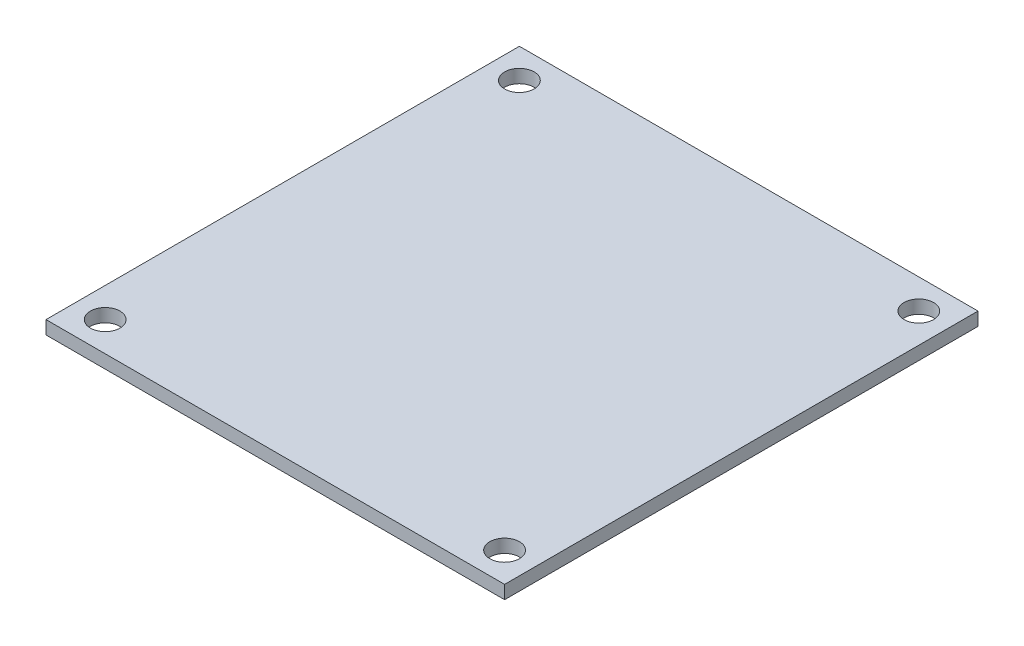
ISO-10303-21;
HEADER;
FILE_DESCRIPTION(('STEP AP214'),'2;1');
FILE_NAME('part.step','',(''),(''),'','','');
FILE_SCHEMA(('AUTOMOTIVE_DESIGN { 1 0 10303 214 1 1 1 1 }'));
ENDSEC;
DATA;
#1=APPLICATION_CONTEXT('core data for automotive mechanical design processes');
#2=APPLICATION_PROTOCOL_DEFINITION('international standard','automotive_design',2000,#1);
#3=PRODUCT_CONTEXT('',#1,'mechanical');
#4=PRODUCT('Part','Part','',(#3));
#5=PRODUCT_RELATED_PRODUCT_CATEGORY('part','',(#4));
#6=PRODUCT_DEFINITION_FORMATION('','',#4);
#7=PRODUCT_DEFINITION_CONTEXT('part definition',#1,'design');
#8=PRODUCT_DEFINITION('design','',#6,#7);
#9=PRODUCT_DEFINITION_SHAPE('','',#8);
#10=(LENGTH_UNIT() NAMED_UNIT(*) SI_UNIT(.MILLI.,.METRE.));
#11=(NAMED_UNIT(*) PLANE_ANGLE_UNIT() SI_UNIT($,.RADIAN.));
#12=(NAMED_UNIT(*) SI_UNIT($,.STERADIAN.) SOLID_ANGLE_UNIT());
#13=UNCERTAINTY_MEASURE_WITH_UNIT(LENGTH_MEASURE(1.E-05),#10,'distance_accuracy_value','');
#14=(GEOMETRIC_REPRESENTATION_CONTEXT(3) GLOBAL_UNCERTAINTY_ASSIGNED_CONTEXT((#13)) GLOBAL_UNIT_ASSIGNED_CONTEXT((#10,
#11,#12)) REPRESENTATION_CONTEXT('',''));
#15=CARTESIAN_POINT('',(0.,0.,0.));
#16=DIRECTION('',(0.,0.,1.));
#17=DIRECTION('',(1.,0.,0.));
#18=AXIS2_PLACEMENT_3D('',#15,#16,#17);
#19=CARTESIAN_POINT('',(0.,0.9,0.));
#20=DIRECTION('',(1.,0.,0.));
#21=DIRECTION('',(0.,0.,-1.));
#22=AXIS2_PLACEMENT_3D('',#19,#20,#21);
#23=PLANE('',#22);
#24=DIRECTION('',(0.,0.,1.));
#25=VECTOR('',#24,1.);
#26=CARTESIAN_POINT('',(0.,0.,0.));
#27=LINE('',#26,#25);
#28=CARTESIAN_POINT('',(0.,0.,-32.));
#29=VERTEX_POINT('',#28);
#30=CARTESIAN_POINT('',(0.,0.,0.));
#31=VERTEX_POINT('',#30);
#32=EDGE_CURVE('E110',#29,#31,#27,.T.);
#33=ORIENTED_EDGE('',*,*,#32,.T.);
#34=DIRECTION('',(0.,-1.,0.));
#35=VECTOR('',#34,1.);
#36=CARTESIAN_POINT('',(0.,0.9,0.));
#37=LINE('',#36,#35);
#38=CARTESIAN_POINT('',(0.,0.9,0.));
#39=VERTEX_POINT('',#38);
#40=EDGE_CURVE('E11',#39,#31,#37,.T.);
#41=ORIENTED_EDGE('',*,*,#40,.F.);
#42=DIRECTION('',(0.,0.,1.));
#43=VECTOR('',#42,1.);
#44=CARTESIAN_POINT('',(0.,0.9,0.));
#45=LINE('',#44,#43);
#46=CARTESIAN_POINT('',(0.,0.9,-32.));
#47=VERTEX_POINT('',#46);
#48=EDGE_CURVE('E98',#47,#39,#45,.T.);
#49=ORIENTED_EDGE('',*,*,#48,.F.);
#50=DIRECTION('',(0.,-1.,0.));
#51=VECTOR('',#50,1.);
#52=CARTESIAN_POINT('',(0.,0.9,-32.));
#53=LINE('',#52,#51);
#54=EDGE_CURVE('E106',#47,#29,#53,.T.);
#55=ORIENTED_EDGE('',*,*,#54,.T.);
#56=EDGE_LOOP('',(#33,#41,#49,#55));
#57=FACE_BOUND('',#56,.T.);
#58=ADVANCED_FACE('F47',(#57),#23,.F.);
#59=CARTESIAN_POINT('',(0.,0.9,0.));
#60=DIRECTION('',(0.,0.,-1.));
#61=DIRECTION('',(-1.,0.,0.));
#62=AXIS2_PLACEMENT_3D('',#59,#60,#61);
#63=PLANE('',#62);
#64=DIRECTION('',(1.,0.,0.));
#65=VECTOR('',#64,1.);
#66=CARTESIAN_POINT('',(0.,0.,0.));
#67=LINE('',#66,#65);
#68=CARTESIAN_POINT('',(31.,0.,0.));
#69=VERTEX_POINT('',#68);
#70=EDGE_CURVE('E102',#31,#69,#67,.T.);
#71=ORIENTED_EDGE('',*,*,#70,.T.);
#72=DIRECTION('',(0.,-1.,0.));
#73=VECTOR('',#72,1.);
#74=CARTESIAN_POINT('',(31.,0.9,0.));
#75=LINE('',#74,#73);
#76=CARTESIAN_POINT('',(31.,0.9,0.));
#77=VERTEX_POINT('',#76);
#78=EDGE_CURVE('E55',#77,#69,#75,.T.);
#79=ORIENTED_EDGE('',*,*,#78,.F.);
#80=DIRECTION('',(1.,0.,0.));
#81=VECTOR('',#80,1.);
#82=CARTESIAN_POINT('',(0.,0.9,0.));
#83=LINE('',#82,#81);
#84=EDGE_CURVE('E93',#39,#77,#83,.T.);
#85=ORIENTED_EDGE('',*,*,#84,.F.);
#86=ORIENTED_EDGE('',*,*,#40,.T.);
#87=EDGE_LOOP('',(#71,#79,#85,#86));
#88=FACE_BOUND('',#87,.T.);
#89=ADVANCED_FACE('F101',(#88),#63,.F.);
#90=CARTESIAN_POINT('',(31.,0.9,0.));
#91=DIRECTION('',(-1.,0.,0.));
#92=DIRECTION('',(0.,0.,1.));
#93=AXIS2_PLACEMENT_3D('',#90,#91,#92);
#94=PLANE('',#93);
#95=DIRECTION('',(0.,0.,-1.));
#96=VECTOR('',#95,1.);
#97=CARTESIAN_POINT('',(31.,0.,0.));
#98=LINE('',#97,#96);
#99=CARTESIAN_POINT('',(31.,0.,-32.));
#100=VERTEX_POINT('',#99);
#101=EDGE_CURVE('E80',#69,#100,#98,.T.);
#102=ORIENTED_EDGE('',*,*,#101,.T.);
#103=DIRECTION('',(0.,-1.,0.));
#104=VECTOR('',#103,1.);
#105=CARTESIAN_POINT('',(31.,0.9,-32.));
#106=LINE('',#105,#104);
#107=CARTESIAN_POINT('',(31.,0.9,-32.));
#108=VERTEX_POINT('',#107);
#109=EDGE_CURVE('E103',#108,#100,#106,.T.);
#110=ORIENTED_EDGE('',*,*,#109,.F.);
#111=DIRECTION('',(0.,0.,-1.));
#112=VECTOR('',#111,1.);
#113=CARTESIAN_POINT('',(31.,0.9,0.));
#114=LINE('',#113,#112);
#115=EDGE_CURVE('E96',#77,#108,#114,.T.);
#116=ORIENTED_EDGE('',*,*,#115,.F.);
#117=ORIENTED_EDGE('',*,*,#78,.T.);
#118=EDGE_LOOP('',(#102,#110,#116,#117));
#119=FACE_BOUND('',#118,.T.);
#120=ADVANCED_FACE('F104',(#119),#94,.F.);
#121=CARTESIAN_POINT('',(0.,0.9,-32.));
#122=DIRECTION('',(0.,0.,1.));
#123=DIRECTION('',(1.,0.,0.));
#124=AXIS2_PLACEMENT_3D('',#121,#122,#123);
#125=PLANE('',#124);
#126=DIRECTION('',(-1.,0.,0.));
#127=VECTOR('',#126,1.);
#128=CARTESIAN_POINT('',(0.,0.,-32.));
#129=LINE('',#128,#127);
#130=EDGE_CURVE('E86',#100,#29,#129,.T.);
#131=ORIENTED_EDGE('',*,*,#130,.T.);
#132=ORIENTED_EDGE('',*,*,#54,.F.);
#133=DIRECTION('',(-1.,0.,0.));
#134=VECTOR('',#133,1.);
#135=CARTESIAN_POINT('',(0.,0.9,-32.));
#136=LINE('',#135,#134);
#137=EDGE_CURVE('E63',#108,#47,#136,.T.);
#138=ORIENTED_EDGE('',*,*,#137,.F.);
#139=ORIENTED_EDGE('',*,*,#109,.T.);
#140=EDGE_LOOP('',(#131,#132,#138,#139));
#141=FACE_BOUND('',#140,.T.);
#142=ADVANCED_FACE('F118',(#141),#125,.F.);
#143=CARTESIAN_POINT('',(0.,0.9,0.));
#144=DIRECTION('',(0.,-1.,0.));
#145=DIRECTION('',(0.,0.,-1.));
#146=AXIS2_PLACEMENT_3D('',#143,#144,#145);
#147=PLANE('',#146);
#148=CARTESIAN_POINT('',(2.,0.9,-2.));
#149=DIRECTION('',(0.,1.,0.));
#150=DIRECTION('',(0.,0.,1.));
#151=AXIS2_PLACEMENT_3D('',#148,#149,#150);
#152=CIRCLE('',#151,1.);
#153=CARTESIAN_POINT('',(2.,0.9,-1.));
#154=VERTEX_POINT('',#153);
#155=EDGE_CURVE('E133',#154,#154,#152,.T.);
#156=ORIENTED_EDGE('',*,*,#155,.F.);
#157=EDGE_LOOP('',(#156));
#158=FACE_BOUND('',#157,.T.);
#159=CARTESIAN_POINT('',(29.,0.9,-2.00000000000001));
#160=DIRECTION('',(0.,1.,0.));
#161=DIRECTION('',(0.,0.,1.));
#162=AXIS2_PLACEMENT_3D('',#159,#160,#161);
#163=CIRCLE('',#162,1.);
#164=CARTESIAN_POINT('',(29.,0.9,-1.));
#165=VERTEX_POINT('',#164);
#166=EDGE_CURVE('E139',#165,#165,#163,.T.);
#167=ORIENTED_EDGE('',*,*,#166,.F.);
#168=EDGE_LOOP('',(#167));
#169=FACE_BOUND('',#168,.T.);
#170=CARTESIAN_POINT('',(29.,0.9,-30.));
#171=DIRECTION('',(0.,1.,0.));
#172=DIRECTION('',(0.,0.,1.));
#173=AXIS2_PLACEMENT_3D('',#170,#171,#172);
#174=CIRCLE('',#173,1.);
#175=CARTESIAN_POINT('',(29.,0.9,-29.));
#176=VERTEX_POINT('',#175);
#177=EDGE_CURVE('E127',#176,#176,#174,.T.);
#178=ORIENTED_EDGE('',*,*,#177,.F.);
#179=EDGE_LOOP('',(#178));
#180=FACE_BOUND('',#179,.T.);
#181=CARTESIAN_POINT('',(2.,0.9,-30.));
#182=DIRECTION('',(0.,1.,0.));
#183=DIRECTION('',(0.,0.,1.));
#184=AXIS2_PLACEMENT_3D('',#181,#182,#183);
#185=CIRCLE('',#184,1.);
#186=CARTESIAN_POINT('',(2.,0.9,-29.));
#187=VERTEX_POINT('',#186);
#188=EDGE_CURVE('E124',#187,#187,#185,.T.);
#189=ORIENTED_EDGE('',*,*,#188,.F.);
#190=EDGE_LOOP('',(#189));
#191=FACE_BOUND('',#190,.T.);
#192=ORIENTED_EDGE('',*,*,#48,.T.);
#193=ORIENTED_EDGE('',*,*,#84,.T.);
#194=ORIENTED_EDGE('',*,*,#115,.T.);
#195=ORIENTED_EDGE('',*,*,#137,.T.);
#196=EDGE_LOOP('',(#192,#193,#194,#195));
#197=FACE_BOUND('',#196,.T.);
#198=ADVANCED_FACE('F94',(#158,#169,#180,#191,#197),#147,.F.);
#199=CARTESIAN_POINT('',(0.,0.,0.));
#200=DIRECTION('',(0.,-1.,0.));
#201=DIRECTION('',(0.,0.,-1.));
#202=AXIS2_PLACEMENT_3D('',#199,#200,#201);
#203=PLANE('',#202);
#204=CARTESIAN_POINT('',(2.,0.,-2.));
#205=DIRECTION('',(0.,1.,0.));
#206=DIRECTION('',(0.,0.,1.));
#207=AXIS2_PLACEMENT_3D('',#204,#205,#206);
#208=CIRCLE('',#207,1.);
#209=CARTESIAN_POINT('',(2.,0.,-1.));
#210=VERTEX_POINT('',#209);
#211=EDGE_CURVE('E130',#210,#210,#208,.T.);
#212=ORIENTED_EDGE('',*,*,#211,.T.);
#213=EDGE_LOOP('',(#212));
#214=FACE_BOUND('',#213,.T.);
#215=CARTESIAN_POINT('',(29.,0.,-2.00000000000001));
#216=DIRECTION('',(0.,1.,0.));
#217=DIRECTION('',(0.,0.,1.));
#218=AXIS2_PLACEMENT_3D('',#215,#216,#217);
#219=CIRCLE('',#218,1.);
#220=CARTESIAN_POINT('',(29.,0.,-1.));
#221=VERTEX_POINT('',#220);
#222=EDGE_CURVE('E136',#221,#221,#219,.T.);
#223=ORIENTED_EDGE('',*,*,#222,.T.);
#224=EDGE_LOOP('',(#223));
#225=FACE_BOUND('',#224,.T.);
#226=CARTESIAN_POINT('',(29.,0.,-30.));
#227=DIRECTION('',(0.,1.,0.));
#228=DIRECTION('',(0.,0.,1.));
#229=AXIS2_PLACEMENT_3D('',#226,#227,#228);
#230=CIRCLE('',#229,1.);
#231=CARTESIAN_POINT('',(29.,0.,-29.));
#232=VERTEX_POINT('',#231);
#233=EDGE_CURVE('E142',#232,#232,#230,.T.);
#234=ORIENTED_EDGE('',*,*,#233,.T.);
#235=EDGE_LOOP('',(#234));
#236=FACE_BOUND('',#235,.T.);
#237=CARTESIAN_POINT('',(2.,0.,-30.));
#238=DIRECTION('',(0.,1.,0.));
#239=DIRECTION('',(0.,0.,1.));
#240=AXIS2_PLACEMENT_3D('',#237,#238,#239);
#241=CIRCLE('',#240,1.);
#242=CARTESIAN_POINT('',(2.,0.,-29.));
#243=VERTEX_POINT('',#242);
#244=EDGE_CURVE('E113',#243,#243,#241,.T.);
#245=ORIENTED_EDGE('',*,*,#244,.T.);
#246=EDGE_LOOP('',(#245));
#247=FACE_BOUND('',#246,.T.);
#248=ORIENTED_EDGE('',*,*,#32,.F.);
#249=ORIENTED_EDGE('',*,*,#130,.F.);
#250=ORIENTED_EDGE('',*,*,#101,.F.);
#251=ORIENTED_EDGE('',*,*,#70,.F.);
#252=EDGE_LOOP('',(#248,#249,#250,#251));
#253=FACE_BOUND('',#252,.T.);
#254=ADVANCED_FACE('F121',(#214,#225,#236,#247,#253),#203,.T.);
#255=CARTESIAN_POINT('',(2.,0.,-30.));
#256=DIRECTION('',(0.,1.,0.));
#257=DIRECTION('',(0.,0.,1.));
#258=AXIS2_PLACEMENT_3D('',#255,#256,#257);
#259=CYLINDRICAL_SURFACE('',#258,1.);
#260=ORIENTED_EDGE('',*,*,#244,.F.);
#261=EDGE_LOOP('',(#260));
#262=FACE_BOUND('',#261,.T.);
#263=ORIENTED_EDGE('',*,*,#188,.T.);
#264=EDGE_LOOP('',(#263));
#265=FACE_BOUND('',#264,.T.);
#266=ADVANCED_FACE('F156',(#262,#265),#259,.F.);
#267=CARTESIAN_POINT('',(29.,0.,-30.));
#268=DIRECTION('',(0.,1.,0.));
#269=DIRECTION('',(0.,0.,1.));
#270=AXIS2_PLACEMENT_3D('',#267,#268,#269);
#271=CYLINDRICAL_SURFACE('',#270,1.);
#272=ORIENTED_EDGE('',*,*,#233,.F.);
#273=EDGE_LOOP('',(#272));
#274=FACE_BOUND('',#273,.T.);
#275=ORIENTED_EDGE('',*,*,#177,.T.);
#276=EDGE_LOOP('',(#275));
#277=FACE_BOUND('',#276,.T.);
#278=ADVANCED_FACE('F148',(#274,#277),#271,.F.);
#279=CARTESIAN_POINT('',(29.,0.,-2.00000000000001));
#280=DIRECTION('',(0.,1.,0.));
#281=DIRECTION('',(0.,0.,1.));
#282=AXIS2_PLACEMENT_3D('',#279,#280,#281);
#283=CYLINDRICAL_SURFACE('',#282,1.);
#284=ORIENTED_EDGE('',*,*,#222,.F.);
#285=EDGE_LOOP('',(#284));
#286=FACE_BOUND('',#285,.T.);
#287=ORIENTED_EDGE('',*,*,#166,.T.);
#288=EDGE_LOOP('',(#287));
#289=FACE_BOUND('',#288,.T.);
#290=ADVANCED_FACE('F164',(#286,#289),#283,.F.);
#291=CARTESIAN_POINT('',(2.,0.,-2.));
#292=DIRECTION('',(0.,1.,0.));
#293=DIRECTION('',(0.,0.,1.));
#294=AXIS2_PLACEMENT_3D('',#291,#292,#293);
#295=CYLINDRICAL_SURFACE('',#294,1.);
#296=ORIENTED_EDGE('',*,*,#211,.F.);
#297=EDGE_LOOP('',(#296));
#298=FACE_BOUND('',#297,.T.);
#299=ORIENTED_EDGE('',*,*,#155,.T.);
#300=EDGE_LOOP('',(#299));
#301=FACE_BOUND('',#300,.T.);
#302=ADVANCED_FACE('F219',(#298,#301),#295,.F.);
#303=CLOSED_SHELL('',(#58,#89,#120,#142,#198,#254,#266,#278,#290,#302));
#304=MANIFOLD_SOLID_BREP('B2',#303);
#305=ADVANCED_BREP_SHAPE_REPRESENTATION('',(#18,#304),#14);
#306=SHAPE_DEFINITION_REPRESENTATION(#9,#305);
ENDSEC;
END-ISO-10303-21;
